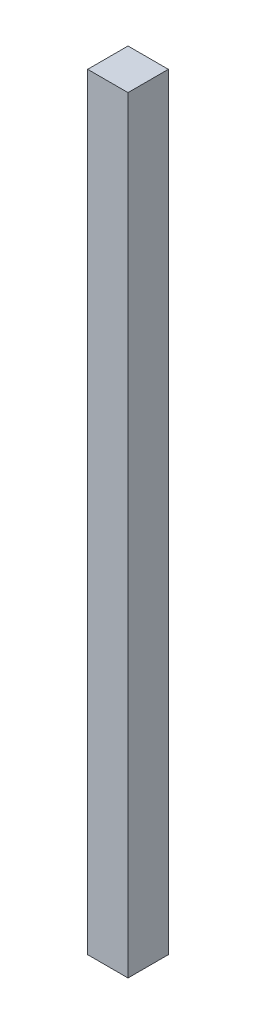
ISO-10303-21;
HEADER;
FILE_DESCRIPTION(('STEP AP214'),'2;1');
FILE_NAME('part.step','',(''),(''),'','','');
FILE_SCHEMA(('AUTOMOTIVE_DESIGN { 1 0 10303 214 1 1 1 1 }'));
ENDSEC;
DATA;
#1=APPLICATION_CONTEXT('core data for automotive mechanical design processes');
#2=APPLICATION_PROTOCOL_DEFINITION('international standard','automotive_design',2000,#1);
#3=PRODUCT_CONTEXT('',#1,'mechanical');
#4=PRODUCT('Part','Part','',(#3));
#5=PRODUCT_RELATED_PRODUCT_CATEGORY('part','',(#4));
#6=PRODUCT_DEFINITION_FORMATION('','',#4);
#7=PRODUCT_DEFINITION_CONTEXT('part definition',#1,'design');
#8=PRODUCT_DEFINITION('design','',#6,#7);
#9=PRODUCT_DEFINITION_SHAPE('','',#8);
#10=(LENGTH_UNIT() NAMED_UNIT(*) SI_UNIT(.MILLI.,.METRE.));
#11=(NAMED_UNIT(*) PLANE_ANGLE_UNIT() SI_UNIT($,.RADIAN.));
#12=(NAMED_UNIT(*) SI_UNIT($,.STERADIAN.) SOLID_ANGLE_UNIT());
#13=UNCERTAINTY_MEASURE_WITH_UNIT(LENGTH_MEASURE(1.E-05),#10,'distance_accuracy_value','');
#14=(GEOMETRIC_REPRESENTATION_CONTEXT(3) GLOBAL_UNCERTAINTY_ASSIGNED_CONTEXT((#13)) GLOBAL_UNIT_ASSIGNED_CONTEXT((#10,
#11,#12)) REPRESENTATION_CONTEXT('',''));
#15=CARTESIAN_POINT('',(0.,0.,0.));
#16=DIRECTION('',(0.,0.,1.));
#17=DIRECTION('',(1.,0.,0.));
#18=AXIS2_PLACEMENT_3D('',#15,#16,#17);
#19=CARTESIAN_POINT('',(50.,1900.,50.));
#20=DIRECTION('',(-1.,0.,0.));
#21=DIRECTION('',(0.,0.,1.));
#22=AXIS2_PLACEMENT_3D('',#19,#20,#21);
#23=PLANE('',#22);
#24=DIRECTION('',(0.,0.,-1.));
#25=VECTOR('',#24,1.);
#26=CARTESIAN_POINT('',(50.,0.,50.));
#27=LINE('',#26,#25);
#28=CARTESIAN_POINT('',(50.,0.,50.));
#29=VERTEX_POINT('',#28);
#30=CARTESIAN_POINT('',(50.,0.,-50.));
#31=VERTEX_POINT('',#30);
#32=EDGE_CURVE('E98',#29,#31,#27,.T.);
#33=ORIENTED_EDGE('',*,*,#32,.T.);
#34=DIRECTION('',(0.,-1.,0.));
#35=VECTOR('',#34,1.);
#36=CARTESIAN_POINT('',(50.,1900.,-50.));
#37=LINE('',#36,#35);
#38=CARTESIAN_POINT('',(50.,1900.,-50.));
#39=VERTEX_POINT('',#38);
#40=EDGE_CURVE('E11',#39,#31,#37,.T.);
#41=ORIENTED_EDGE('',*,*,#40,.F.);
#42=DIRECTION('',(0.,0.,-1.));
#43=VECTOR('',#42,1.);
#44=CARTESIAN_POINT('',(50.,1900.,50.));
#45=LINE('',#44,#43);
#46=CARTESIAN_POINT('',(50.,1900.,50.));
#47=VERTEX_POINT('',#46);
#48=EDGE_CURVE('E86',#47,#39,#45,.T.);
#49=ORIENTED_EDGE('',*,*,#48,.F.);
#50=DIRECTION('',(0.,-1.,0.));
#51=VECTOR('',#50,1.);
#52=CARTESIAN_POINT('',(50.,1900.,50.));
#53=LINE('',#52,#51);
#54=EDGE_CURVE('E94',#47,#29,#53,.T.);
#55=ORIENTED_EDGE('',*,*,#54,.T.);
#56=EDGE_LOOP('',(#33,#41,#49,#55));
#57=FACE_BOUND('',#56,.T.);
#58=ADVANCED_FACE('F35',(#57),#23,.F.);
#59=CARTESIAN_POINT('',(-50.,1900.,-50.));
#60=DIRECTION('',(0.,0.,1.));
#61=DIRECTION('',(1.,0.,0.));
#62=AXIS2_PLACEMENT_3D('',#59,#60,#61);
#63=PLANE('',#62);
#64=DIRECTION('',(-1.,0.,0.));
#65=VECTOR('',#64,1.);
#66=CARTESIAN_POINT('',(-50.,0.,-50.));
#67=LINE('',#66,#65);
#68=CARTESIAN_POINT('',(-50.,0.,-50.));
#69=VERTEX_POINT('',#68);
#70=EDGE_CURVE('E90',#31,#69,#67,.T.);
#71=ORIENTED_EDGE('',*,*,#70,.T.);
#72=DIRECTION('',(0.,-1.,0.));
#73=VECTOR('',#72,1.);
#74=CARTESIAN_POINT('',(-50.,1900.,-50.));
#75=LINE('',#74,#73);
#76=CARTESIAN_POINT('',(-50.,1900.,-50.));
#77=VERTEX_POINT('',#76);
#78=EDGE_CURVE('E43',#77,#69,#75,.T.);
#79=ORIENTED_EDGE('',*,*,#78,.F.);
#80=DIRECTION('',(-1.,0.,0.));
#81=VECTOR('',#80,1.);
#82=CARTESIAN_POINT('',(-50.,1900.,-50.));
#83=LINE('',#82,#81);
#84=EDGE_CURVE('E81',#39,#77,#83,.T.);
#85=ORIENTED_EDGE('',*,*,#84,.F.);
#86=ORIENTED_EDGE('',*,*,#40,.T.);
#87=EDGE_LOOP('',(#71,#79,#85,#86));
#88=FACE_BOUND('',#87,.T.);
#89=ADVANCED_FACE('F89',(#88),#63,.F.);
#90=CARTESIAN_POINT('',(-50.,1900.,50.));
#91=DIRECTION('',(1.,0.,0.));
#92=DIRECTION('',(0.,0.,-1.));
#93=AXIS2_PLACEMENT_3D('',#90,#91,#92);
#94=PLANE('',#93);
#95=DIRECTION('',(0.,0.,1.));
#96=VECTOR('',#95,1.);
#97=CARTESIAN_POINT('',(-50.,0.,50.));
#98=LINE('',#97,#96);
#99=CARTESIAN_POINT('',(-50.,0.,50.));
#100=VERTEX_POINT('',#99);
#101=EDGE_CURVE('E68',#69,#100,#98,.T.);
#102=ORIENTED_EDGE('',*,*,#101,.T.);
#103=DIRECTION('',(0.,-1.,0.));
#104=VECTOR('',#103,1.);
#105=CARTESIAN_POINT('',(-50.,1900.,50.));
#106=LINE('',#105,#104);
#107=CARTESIAN_POINT('',(-50.,1900.,50.));
#108=VERTEX_POINT('',#107);
#109=EDGE_CURVE('E91',#108,#100,#106,.T.);
#110=ORIENTED_EDGE('',*,*,#109,.F.);
#111=DIRECTION('',(0.,0.,1.));
#112=VECTOR('',#111,1.);
#113=CARTESIAN_POINT('',(-50.,1900.,50.));
#114=LINE('',#113,#112);
#115=EDGE_CURVE('E84',#77,#108,#114,.T.);
#116=ORIENTED_EDGE('',*,*,#115,.F.);
#117=ORIENTED_EDGE('',*,*,#78,.T.);
#118=EDGE_LOOP('',(#102,#110,#116,#117));
#119=FACE_BOUND('',#118,.T.);
#120=ADVANCED_FACE('F92',(#119),#94,.F.);
#121=CARTESIAN_POINT('',(-50.,1900.,50.));
#122=DIRECTION('',(0.,0.,-1.));
#123=DIRECTION('',(-1.,0.,0.));
#124=AXIS2_PLACEMENT_3D('',#121,#122,#123);
#125=PLANE('',#124);
#126=DIRECTION('',(1.,0.,0.));
#127=VECTOR('',#126,1.);
#128=CARTESIAN_POINT('',(-50.,0.,50.));
#129=LINE('',#128,#127);
#130=EDGE_CURVE('E74',#100,#29,#129,.T.);
#131=ORIENTED_EDGE('',*,*,#130,.T.);
#132=ORIENTED_EDGE('',*,*,#54,.F.);
#133=DIRECTION('',(1.,0.,0.));
#134=VECTOR('',#133,1.);
#135=CARTESIAN_POINT('',(-50.,1900.,50.));
#136=LINE('',#135,#134);
#137=EDGE_CURVE('E51',#108,#47,#136,.T.);
#138=ORIENTED_EDGE('',*,*,#137,.F.);
#139=ORIENTED_EDGE('',*,*,#109,.T.);
#140=EDGE_LOOP('',(#131,#132,#138,#139));
#141=FACE_BOUND('',#140,.T.);
#142=ADVANCED_FACE('F105',(#141),#125,.F.);
#143=CARTESIAN_POINT('',(0.,1900.,0.));
#144=DIRECTION('',(0.,-1.,0.));
#145=DIRECTION('',(0.,0.,-1.));
#146=AXIS2_PLACEMENT_3D('',#143,#144,#145);
#147=PLANE('',#146);
#148=ORIENTED_EDGE('',*,*,#48,.T.);
#149=ORIENTED_EDGE('',*,*,#84,.T.);
#150=ORIENTED_EDGE('',*,*,#115,.T.);
#151=ORIENTED_EDGE('',*,*,#137,.T.);
#152=EDGE_LOOP('',(#148,#149,#150,#151));
#153=FACE_BOUND('',#152,.T.);
#154=ADVANCED_FACE('F82',(#153),#147,.F.);
#155=CARTESIAN_POINT('',(0.,0.,0.));
#156=DIRECTION('',(0.,-1.,0.));
#157=DIRECTION('',(0.,0.,-1.));
#158=AXIS2_PLACEMENT_3D('',#155,#156,#157);
#159=PLANE('',#158);
#160=ORIENTED_EDGE('',*,*,#32,.F.);
#161=ORIENTED_EDGE('',*,*,#130,.F.);
#162=ORIENTED_EDGE('',*,*,#101,.F.);
#163=ORIENTED_EDGE('',*,*,#70,.F.);
#164=EDGE_LOOP('',(#160,#161,#162,#163));
#165=FACE_BOUND('',#164,.T.);
#166=ADVANCED_FACE('F108',(#165),#159,.T.);
#167=CLOSED_SHELL('',(#58,#89,#120,#142,#154,#166));
#168=MANIFOLD_SOLID_BREP('B2',#167);
#169=ADVANCED_BREP_SHAPE_REPRESENTATION('',(#18,#168),#14);
#170=SHAPE_DEFINITION_REPRESENTATION(#9,#169);
ENDSEC;
END-ISO-10303-21;
